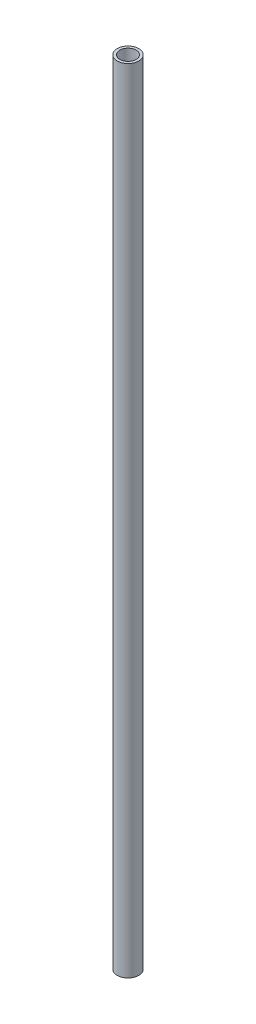
ISO-10303-21;
HEADER;
FILE_DESCRIPTION(('STEP AP214'),'2;1');
FILE_NAME('part.step','',(''),(''),'','','');
FILE_SCHEMA(('AUTOMOTIVE_DESIGN { 1 0 10303 214 1 1 1 1 }'));
ENDSEC;
DATA;
#1=APPLICATION_CONTEXT('core data for automotive mechanical design processes');
#2=APPLICATION_PROTOCOL_DEFINITION('international standard','automotive_design',2000,#1);
#3=PRODUCT_CONTEXT('',#1,'mechanical');
#4=PRODUCT('Part','Part','',(#3));
#5=PRODUCT_RELATED_PRODUCT_CATEGORY('part','',(#4));
#6=PRODUCT_DEFINITION_FORMATION('','',#4);
#7=PRODUCT_DEFINITION_CONTEXT('part definition',#1,'design');
#8=PRODUCT_DEFINITION('design','',#6,#7);
#9=PRODUCT_DEFINITION_SHAPE('','',#8);
#10=(LENGTH_UNIT() NAMED_UNIT(*) SI_UNIT(.MILLI.,.METRE.));
#11=(NAMED_UNIT(*) PLANE_ANGLE_UNIT() SI_UNIT($,.RADIAN.));
#12=(NAMED_UNIT(*) SI_UNIT($,.STERADIAN.) SOLID_ANGLE_UNIT());
#13=UNCERTAINTY_MEASURE_WITH_UNIT(LENGTH_MEASURE(1.E-05),#10,'distance_accuracy_value','');
#14=(GEOMETRIC_REPRESENTATION_CONTEXT(3) GLOBAL_UNCERTAINTY_ASSIGNED_CONTEXT((#13)) GLOBAL_UNIT_ASSIGNED_CONTEXT((#10,
#11,#12)) REPRESENTATION_CONTEXT('',''));
#15=CARTESIAN_POINT('',(0.,0.,0.));
#16=DIRECTION('',(0.,0.,1.));
#17=DIRECTION('',(1.,0.,0.));
#18=AXIS2_PLACEMENT_3D('',#15,#16,#17);
#19=CARTESIAN_POINT('',(0.,-164.4,0.));
#20=DIRECTION('',(0.,-1.,0.));
#21=DIRECTION('',(0.,0.,-1.));
#22=AXIS2_PLACEMENT_3D('',#19,#20,#21);
#23=CYLINDRICAL_SURFACE('',#22,1.25);
#24=CARTESIAN_POINT('',(0.,-160.4,0.));
#25=DIRECTION('',(0.,-1.,0.));
#26=DIRECTION('',(0.,0.,-1.));
#27=AXIS2_PLACEMENT_3D('',#24,#25,#26);
#28=CIRCLE('',#27,1.25);
#29=CARTESIAN_POINT('',(0.,-160.4,-1.25));
#30=VERTEX_POINT('',#29);
#31=EDGE_CURVE('E45',#30,#30,#28,.T.);
#32=ORIENTED_EDGE('',*,*,#31,.T.);
#33=EDGE_LOOP('',(#32));
#34=FACE_BOUND('',#33,.T.);
#35=CARTESIAN_POINT('',(0.,-39.,0.));
#36=DIRECTION('',(0.,-1.,0.));
#37=DIRECTION('',(0.,0.,-1.));
#38=AXIS2_PLACEMENT_3D('',#35,#36,#37);
#39=CIRCLE('',#38,1.25);
#40=CARTESIAN_POINT('',(0.,-39.,-1.25));
#41=VERTEX_POINT('',#40);
#42=EDGE_CURVE('E10',#41,#41,#39,.T.);
#43=ORIENTED_EDGE('',*,*,#42,.F.);
#44=EDGE_LOOP('',(#43));
#45=FACE_BOUND('',#44,.T.);
#46=ADVANCED_FACE('F31',(#34,#45),#23,.F.);
#47=CARTESIAN_POINT('',(1.25,-39.,0.));
#48=DIRECTION('',(0.,1.,0.));
#49=DIRECTION('',(0.,0.,1.));
#50=AXIS2_PLACEMENT_3D('',#47,#48,#49);
#51=PLANE('',#50);
#52=ORIENTED_EDGE('',*,*,#42,.T.);
#53=EDGE_LOOP('',(#52));
#54=FACE_BOUND('',#53,.T.);
#55=CARTESIAN_POINT('',(0.,-39.,0.));
#56=DIRECTION('',(0.,-1.,0.));
#57=DIRECTION('',(0.,0.,-1.));
#58=AXIS2_PLACEMENT_3D('',#55,#56,#57);
#59=CIRCLE('',#58,1.65);
#60=CARTESIAN_POINT('',(0.,-39.,-1.65));
#61=VERTEX_POINT('',#60);
#62=EDGE_CURVE('E37',#61,#61,#59,.T.);
#63=ORIENTED_EDGE('',*,*,#62,.F.);
#64=EDGE_LOOP('',(#63));
#65=FACE_BOUND('',#64,.T.);
#66=ADVANCED_FACE('F61',(#54,#65),#51,.T.);
#67=CARTESIAN_POINT('',(0.,-164.4,0.));
#68=DIRECTION('',(0.,-1.,0.));
#69=DIRECTION('',(0.,0.,-1.));
#70=AXIS2_PLACEMENT_3D('',#67,#68,#69);
#71=CYLINDRICAL_SURFACE('',#70,1.65);
#72=ORIENTED_EDGE('',*,*,#62,.T.);
#73=EDGE_LOOP('',(#72));
#74=FACE_BOUND('',#73,.T.);
#75=CARTESIAN_POINT('',(0.,-160.4,0.));
#76=DIRECTION('',(0.,-1.,0.));
#77=DIRECTION('',(0.,0.,-1.));
#78=AXIS2_PLACEMENT_3D('',#75,#76,#77);
#79=CIRCLE('',#78,1.65);
#80=CARTESIAN_POINT('',(0.,-160.4,-1.65));
#81=VERTEX_POINT('',#80);
#82=EDGE_CURVE('E41',#81,#81,#79,.T.);
#83=ORIENTED_EDGE('',*,*,#82,.F.);
#84=EDGE_LOOP('',(#83));
#85=FACE_BOUND('',#84,.T.);
#86=ADVANCED_FACE('F55',(#74,#85),#71,.T.);
#87=CARTESIAN_POINT('',(1.65,-160.4,0.));
#88=DIRECTION('',(0.,-1.,0.));
#89=DIRECTION('',(0.,0.,-1.));
#90=AXIS2_PLACEMENT_3D('',#87,#88,#89);
#91=PLANE('',#90);
#92=ORIENTED_EDGE('',*,*,#82,.T.);
#93=EDGE_LOOP('',(#92));
#94=FACE_BOUND('',#93,.T.);
#95=ORIENTED_EDGE('',*,*,#31,.F.);
#96=EDGE_LOOP('',(#95));
#97=FACE_BOUND('',#96,.T.);
#98=ADVANCED_FACE('F53',(#94,#97),#91,.T.);
#99=CLOSED_SHELL('',(#46,#66,#86,#98));
#100=MANIFOLD_SOLID_BREP('B2',#99);
#101=ADVANCED_BREP_SHAPE_REPRESENTATION('',(#18,#100),#14);
#102=SHAPE_DEFINITION_REPRESENTATION(#9,#101);
ENDSEC;
END-ISO-10303-21;
